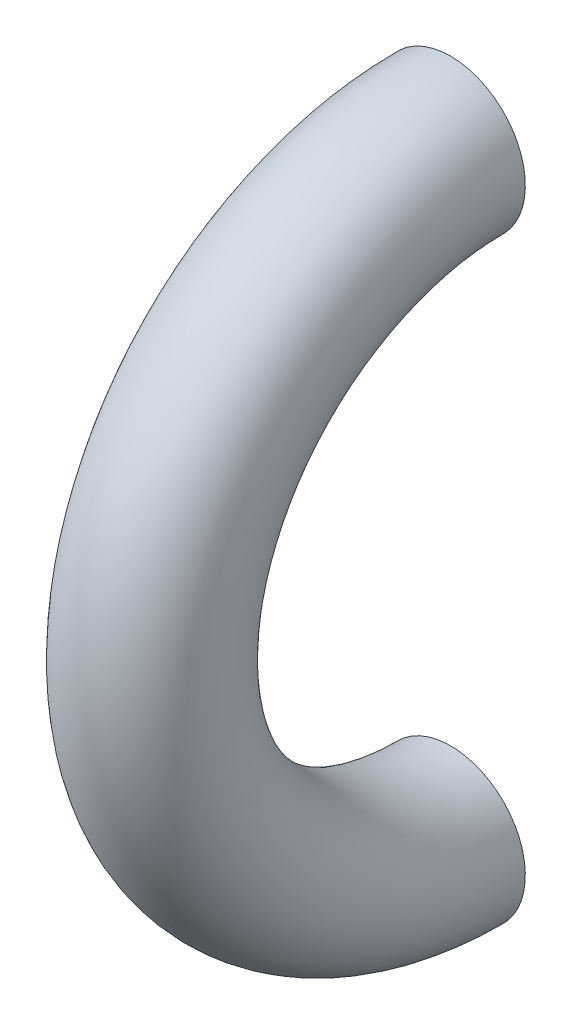
ISO-10303-21;
HEADER;
FILE_DESCRIPTION(('STEP AP214'),'2;1');
FILE_NAME('part.step','',(''),(''),'','','');
FILE_SCHEMA(('AUTOMOTIVE_DESIGN { 1 0 10303 214 1 1 1 1 }'));
ENDSEC;
DATA;
#1=APPLICATION_CONTEXT('core data for automotive mechanical design processes');
#2=APPLICATION_PROTOCOL_DEFINITION('international standard','automotive_design',2000,#1);
#3=PRODUCT_CONTEXT('',#1,'mechanical');
#4=PRODUCT('Part','Part','',(#3));
#5=PRODUCT_RELATED_PRODUCT_CATEGORY('part','',(#4));
#6=PRODUCT_DEFINITION_FORMATION('','',#4);
#7=PRODUCT_DEFINITION_CONTEXT('part definition',#1,'design');
#8=PRODUCT_DEFINITION('design','',#6,#7);
#9=PRODUCT_DEFINITION_SHAPE('','',#8);
#10=(LENGTH_UNIT() NAMED_UNIT(*) SI_UNIT(.MILLI.,.METRE.));
#11=(NAMED_UNIT(*) PLANE_ANGLE_UNIT() SI_UNIT($,.RADIAN.));
#12=(NAMED_UNIT(*) SI_UNIT($,.STERADIAN.) SOLID_ANGLE_UNIT());
#13=UNCERTAINTY_MEASURE_WITH_UNIT(LENGTH_MEASURE(1.E-05),#10,'distance_accuracy_value','');
#14=(GEOMETRIC_REPRESENTATION_CONTEXT(3) GLOBAL_UNCERTAINTY_ASSIGNED_CONTEXT((#13)) GLOBAL_UNIT_ASSIGNED_CONTEXT((#10,
#11,#12)) REPRESENTATION_CONTEXT('',''));
#15=CARTESIAN_POINT('',(0.,0.,0.));
#16=DIRECTION('',(0.,0.,1.));
#17=DIRECTION('',(1.,0.,0.));
#18=AXIS2_PLACEMENT_3D('',#15,#16,#17);
#19=CARTESIAN_POINT('',(0.,0.,0.));
#20=DIRECTION('',(0.,0.,1.));
#21=DIRECTION('',(1.,0.,0.));
#22=AXIS2_PLACEMENT_3D('',#19,#20,#21);
#23=PLANE('',#22);
#24=CARTESIAN_POINT('',(0.,0.,0.));
#25=DIRECTION('',(0.,0.,1.));
#26=DIRECTION('',(1.,0.,0.));
#27=AXIS2_PLACEMENT_3D('',#24,#25,#26);
#28=CIRCLE('',#27,20.);
#29=CARTESIAN_POINT('',(0.,20.,0.));
#30=VERTEX_POINT('',#29);
#31=EDGE_CURVE('E48',#30,#30,#28,.T.);
#32=ORIENTED_EDGE('',*,*,#31,.F.);
#33=EDGE_LOOP('',(#32));
#34=FACE_BOUND('',#33,.T.);
#35=ADVANCED_FACE('F41',(#34),#23,.F.);
#36=CARTESIAN_POINT('',(0.,-160.,0.));
#37=DIRECTION('',(0.,0.,-1.));
#38=DIRECTION('',(1.,0.,0.));
#39=AXIS2_PLACEMENT_3D('',#36,#37,#38);
#40=PLANE('',#39);
#41=CARTESIAN_POINT('',(0.,-160.,0.));
#42=DIRECTION('',(0.,0.,-1.));
#43=DIRECTION('',(1.,0.,0.));
#44=AXIS2_PLACEMENT_3D('',#41,#42,#43);
#45=CIRCLE('',#44,20.);
#46=CARTESIAN_POINT('',(0.,-180.,0.));
#47=VERTEX_POINT('',#46);
#48=EDGE_CURVE('E10',#47,#47,#45,.T.);
#49=ORIENTED_EDGE('',*,*,#48,.T.);
#50=EDGE_LOOP('',(#49));
#51=FACE_BOUND('',#50,.T.);
#52=ADVANCED_FACE('F58',(#51),#40,.T.);
#53=CARTESIAN_POINT('',(0.,-80.,0.));
#54=DIRECTION('',(1.,0.,0.));
#55=DIRECTION('',(0.,0.,-1.));
#56=AXIS2_PLACEMENT_3D('',#53,#54,#55);
#57=TOROIDAL_SURFACE('',#56,80.,20.);
#58=CARTESIAN_POINT('',(0.,-80.,0.));
#59=DIRECTION('',(1.,0.,0.));
#60=DIRECTION('',(0.,0.,-1.));
#61=AXIS2_PLACEMENT_3D('',#58,#59,#60);
#62=CIRCLE('',#61,100.);
#63=EDGE_CURVE('',#30,#47,#62,.T.);
#64=ORIENTED_EDGE('',*,*,#31,.T.);
#65=ORIENTED_EDGE('',*,*,#48,.F.);
#66=ORIENTED_EDGE('',*,*,#63,.T.);
#67=ORIENTED_EDGE('',*,*,#63,.F.);
#68=EDGE_LOOP('',(#64,#66,#65,#67));
#69=FACE_BOUND('',#68,.T.);
#70=ADVANCED_FACE('F55',(#69),#57,.T.);
#71=CLOSED_SHELL('',(#35,#52,#70));
#72=MANIFOLD_SOLID_BREP('B2',#71);
#73=ADVANCED_BREP_SHAPE_REPRESENTATION('',(#18,#72),#14);
#74=SHAPE_DEFINITION_REPRESENTATION(#9,#73);
ENDSEC;
END-ISO-10303-21;
